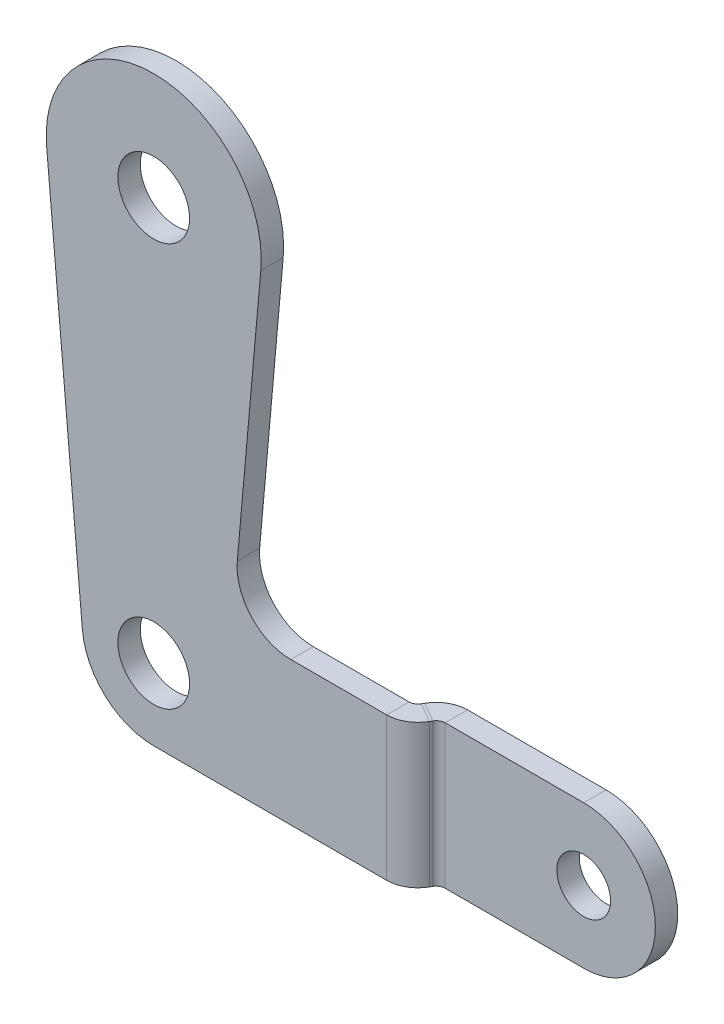
ISO-10303-21;
HEADER;
FILE_DESCRIPTION(('STEP AP214'),'2;1');
FILE_NAME('part.step','',(''),(''),'','','');
FILE_SCHEMA(('AUTOMOTIVE_DESIGN { 1 0 10303 214 1 1 1 1 }'));
ENDSEC;
DATA;
#1=APPLICATION_CONTEXT('core data for automotive mechanical design processes');
#2=APPLICATION_PROTOCOL_DEFINITION('international standard','automotive_design',2000,#1);
#3=PRODUCT_CONTEXT('',#1,'mechanical');
#4=PRODUCT('Part','Part','',(#3));
#5=PRODUCT_RELATED_PRODUCT_CATEGORY('part','',(#4));
#6=PRODUCT_DEFINITION_FORMATION('','',#4);
#7=PRODUCT_DEFINITION_CONTEXT('part definition',#1,'design');
#8=PRODUCT_DEFINITION('design','',#6,#7);
#9=PRODUCT_DEFINITION_SHAPE('','',#8);
#10=(LENGTH_UNIT() NAMED_UNIT(*) SI_UNIT(.MILLI.,.METRE.));
#11=(NAMED_UNIT(*) PLANE_ANGLE_UNIT() SI_UNIT($,.RADIAN.));
#12=(NAMED_UNIT(*) SI_UNIT($,.STERADIAN.) SOLID_ANGLE_UNIT());
#13=UNCERTAINTY_MEASURE_WITH_UNIT(LENGTH_MEASURE(1.E-05),#10,'distance_accuracy_value','');
#14=(GEOMETRIC_REPRESENTATION_CONTEXT(3) GLOBAL_UNCERTAINTY_ASSIGNED_CONTEXT((#13)) GLOBAL_UNIT_ASSIGNED_CONTEXT((#10,
#11,#12)) REPRESENTATION_CONTEXT('',''));
#15=CARTESIAN_POINT('',(0.,0.,0.));
#16=DIRECTION('',(0.,0.,1.));
#17=DIRECTION('',(1.,0.,0.));
#18=AXIS2_PLACEMENT_3D('',#15,#16,#17);
#19=CARTESIAN_POINT('',(22.5055060006911,14.,12.0526411535477));
#20=DIRECTION('',(0.86602540378444,0.,0.499999999999998));
#21=DIRECTION('',(0.499999999999998,0.,-0.86602540378444));
#22=AXIS2_PLACEMENT_3D('',#19,#20,#21);
#23=PLANE('',#22);
#24=DIRECTION('',(0.499999999999998,0.,-0.86602540378444));
#25=VECTOR('',#24,1.);
#26=CARTESIAN_POINT('',(14.8529916681494,-7.99999999999999,25.3071847831589));
#27=LINE('',#26,#25);
#28=CARTESIAN_POINT('',(29.0310889132455,-7.99999999999999,0.749999999999994));
#29=VERTEX_POINT('',#28);
#30=CARTESIAN_POINT('',(29.1754264805429,-7.99999999999999,0.49999999999999));
#31=VERTEX_POINT('',#30);
#32=EDGE_CURVE('E49',#29,#31,#27,.T.);
#33=ORIENTED_EDGE('',*,*,#32,.T.);
#34=DIRECTION('',(0.,1.,0.));
#35=VECTOR('',#34,1.);
#36=CARTESIAN_POINT('',(29.1754264805429,14.,0.499999999999987));
#37=LINE('',#36,#35);
#38=CARTESIAN_POINT('',(29.1754264805429,8.00000000000001,0.499999999999989));
#39=VERTEX_POINT('',#38);
#40=EDGE_CURVE('E313',#31,#39,#37,.T.);
#41=ORIENTED_EDGE('',*,*,#40,.T.);
#42=DIRECTION('',(-0.499999999999998,0.,0.86602540378444));
#43=VECTOR('',#42,1.);
#44=CARTESIAN_POINT('',(22.5055060006911,8.00000000000001,12.0526411535477));
#45=LINE('',#44,#43);
#46=CARTESIAN_POINT('',(29.0310889132455,8.00000000000001,0.749999999999993));
#47=VERTEX_POINT('',#46);
#48=EDGE_CURVE('E305',#39,#47,#45,.T.);
#49=ORIENTED_EDGE('',*,*,#48,.T.);
#50=DIRECTION('',(0.,1.,0.));
#51=VECTOR('',#50,1.);
#52=CARTESIAN_POINT('',(29.0310889132455,14.,0.74999999999999));
#53=LINE('',#52,#51);
#54=EDGE_CURVE('E301',#29,#47,#53,.T.);
#55=ORIENTED_EDGE('',*,*,#54,.F.);
#56=EDGE_LOOP('',(#33,#41,#49,#55));
#57=FACE_BOUND('',#56,.T.);
#58=ADVANCED_FACE('F45',(#57),#23,.T.);
#59=CARTESIAN_POINT('',(22.5055060006911,8.00000000000001,12.0526411535477));
#60=DIRECTION('',(0.,1.,0.));
#61=DIRECTION('',(-0.499999999999998,0.,0.86602540378444));
#62=AXIS2_PLACEMENT_3D('',#59,#60,#61);
#63=PLANE('',#62);
#64=ORIENTED_EDGE('',*,*,#48,.F.);
#65=DIRECTION('',(-0.86602540378444,0.,-0.499999999999998));
#66=VECTOR('',#65,1.);
#67=CARTESIAN_POINT('',(29.1754264805429,8.00000000000001,0.499999999999987));
#68=LINE('',#67,#66);
#69=CARTESIAN_POINT('',(27.0103629710818,8.00000000000001,-0.750000000000008));
#70=VERTEX_POINT('',#69);
#71=EDGE_CURVE('E12',#39,#70,#68,.T.);
#72=ORIENTED_EDGE('',*,*,#71,.T.);
#73=DIRECTION('',(0.499999999999998,0.,-0.86602540378444));
#74=VECTOR('',#73,1.);
#75=CARTESIAN_POINT('',(20.34044249123,8.00000000000001,10.8026411535477));
#76=LINE('',#75,#74);
#77=CARTESIAN_POINT('',(26.8660254037844,8.00000000000001,-0.500000000000004));
#78=VERTEX_POINT('',#77);
#79=EDGE_CURVE('E320',#70,#78,#76,.F.);
#80=ORIENTED_EDGE('',*,*,#79,.T.);
#81=DIRECTION('',(-0.86602540378444,0.,-0.499999999999998));
#82=VECTOR('',#81,1.);
#83=CARTESIAN_POINT('',(29.0310889132455,8.00000000000001,0.74999999999999));
#84=LINE('',#83,#82);
#85=EDGE_CURVE('E304',#47,#78,#84,.T.);
#86=ORIENTED_EDGE('',*,*,#85,.F.);
#87=EDGE_LOOP('',(#64,#72,#80,#86));
#88=FACE_BOUND('',#87,.T.);
#89=ADVANCED_FACE('F47',(#88),#63,.T.);
#90=CARTESIAN_POINT('',(14.8529916681494,-7.99999999999999,25.3071847831589));
#91=DIRECTION('',(0.,-1.,0.));
#92=DIRECTION('',(0.499999999999998,0.,-0.86602540378444));
#93=AXIS2_PLACEMENT_3D('',#90,#91,#92);
#94=PLANE('',#93);
#95=DIRECTION('',(0.499999999999998,0.,-0.86602540378444));
#96=VECTOR('',#95,1.);
#97=CARTESIAN_POINT('',(20.34044249123,-7.99999999999999,10.8026411535477));
#98=LINE('',#97,#96);
#99=CARTESIAN_POINT('',(26.8660254037844,-7.99999999999999,-0.500000000000007));
#100=VERTEX_POINT('',#99);
#101=CARTESIAN_POINT('',(27.0103629710818,-7.99999999999999,-0.749999999999993));
#102=VERTEX_POINT('',#101);
#103=EDGE_CURVE('E68',#100,#102,#98,.T.);
#104=ORIENTED_EDGE('',*,*,#103,.T.);
#105=DIRECTION('',(0.86602540378444,0.,0.499999999999998));
#106=VECTOR('',#105,1.);
#107=CARTESIAN_POINT('',(29.1754264805429,-7.99999999999999,0.499999999999983));
#108=LINE('',#107,#106);
#109=EDGE_CURVE('E316',#102,#31,#108,.T.);
#110=ORIENTED_EDGE('',*,*,#109,.T.);
#111=ORIENTED_EDGE('',*,*,#32,.F.);
#112=DIRECTION('',(0.86602540378444,0.,0.499999999999998));
#113=VECTOR('',#112,1.);
#114=CARTESIAN_POINT('',(29.0310889132455,-7.99999999999999,0.749999999999987));
#115=LINE('',#114,#113);
#116=EDGE_CURVE('E310',#100,#29,#115,.T.);
#117=ORIENTED_EDGE('',*,*,#116,.F.);
#118=EDGE_LOOP('',(#104,#110,#111,#117));
#119=FACE_BOUND('',#118,.T.);
#120=ADVANCED_FACE('F329',(#119),#94,.T.);
#121=CARTESIAN_POINT('',(20.34044249123,14.,10.8026411535477));
#122=DIRECTION('',(0.86602540378444,0.,0.499999999999998));
#123=DIRECTION('',(0.499999999999998,0.,-0.86602540378444));
#124=AXIS2_PLACEMENT_3D('',#121,#122,#123);
#125=PLANE('',#124);
#126=DIRECTION('',(0.,1.,0.));
#127=VECTOR('',#126,1.);
#128=CARTESIAN_POINT('',(27.0103629710818,14.,-0.750000000000008));
#129=LINE('',#128,#127);
#130=EDGE_CURVE('E54',#102,#70,#129,.T.);
#131=ORIENTED_EDGE('',*,*,#130,.F.);
#132=ORIENTED_EDGE('',*,*,#103,.F.);
#133=DIRECTION('',(0.,1.,0.));
#134=VECTOR('',#133,1.);
#135=CARTESIAN_POINT('',(26.8660254037844,14.,-0.500000000000004));
#136=LINE('',#135,#134);
#137=EDGE_CURVE('E308',#100,#78,#136,.T.);
#138=ORIENTED_EDGE('',*,*,#137,.T.);
#139=ORIENTED_EDGE('',*,*,#79,.F.);
#140=EDGE_LOOP('',(#131,#132,#138,#139));
#141=FACE_BOUND('',#140,.T.);
#142=ADVANCED_FACE('F368',(#141),#125,.F.);
#143=CARTESIAN_POINT('',(0.,0.,2.5));
#144=DIRECTION('',(0.,0.,1.));
#145=DIRECTION('',(1.,0.,0.));
#146=AXIS2_PLACEMENT_3D('',#143,#144,#145);
#147=CYLINDRICAL_SURFACE('',#146,7.99999999999999);
#148=DIRECTION('',(0.,0.,1.));
#149=VECTOR('',#148,1.);
#150=CARTESIAN_POINT('',(-7.96833238436087,-0.711111111111112,2.5));
#151=LINE('',#150,#149);
#152=CARTESIAN_POINT('',(-7.96833238436087,-0.711111111111112,0.));
#153=VERTEX_POINT('',#152);
#154=CARTESIAN_POINT('',(-7.96833238436087,-0.711111111111112,2.5));
#155=VERTEX_POINT('',#154);
#156=EDGE_CURVE('E290',#153,#155,#151,.T.);
#157=ORIENTED_EDGE('',*,*,#156,.F.);
#158=CARTESIAN_POINT('',(0.,0.,0.));
#159=DIRECTION('',(0.,0.,1.));
#160=DIRECTION('',(1.,0.,0.));
#161=AXIS2_PLACEMENT_3D('',#158,#159,#160);
#162=CIRCLE('',#161,7.99999999999999);
#163=CARTESIAN_POINT('',(0.,-7.99999999999999,0.));
#164=VERTEX_POINT('',#163);
#165=EDGE_CURVE('E297',#153,#164,#162,.T.);
#166=ORIENTED_EDGE('',*,*,#165,.T.);
#167=DIRECTION('',(0.,0.,1.));
#168=VECTOR('',#167,1.);
#169=CARTESIAN_POINT('',(0.,-7.99999999999999,2.5));
#170=LINE('',#169,#168);
#171=CARTESIAN_POINT('',(0.,-7.99999999999999,2.5));
#172=VERTEX_POINT('',#171);
#173=EDGE_CURVE('E295',#164,#172,#170,.T.);
#174=ORIENTED_EDGE('',*,*,#173,.T.);
#175=CARTESIAN_POINT('',(0.,0.,2.5));
#176=DIRECTION('',(0.,0.,1.));
#177=DIRECTION('',(1.,0.,0.));
#178=AXIS2_PLACEMENT_3D('',#175,#176,#177);
#179=CIRCLE('',#178,7.99999999999999);
#180=EDGE_CURVE('E246',#155,#172,#179,.T.);
#181=ORIENTED_EDGE('',*,*,#180,.F.);
#182=EDGE_LOOP('',(#157,#166,#174,#181));
#183=FACE_BOUND('',#182,.T.);
#184=ADVANCED_FACE('F370',(#183),#147,.T.);
#185=CARTESIAN_POINT('',(-11.9524985765413,43.9333333333333,2.5));
#186=DIRECTION('',(-0.99604154804511,-0.0888888888888891,0.));
#187=DIRECTION('',(0.0888888888888891,-0.99604154804511,0.));
#188=AXIS2_PLACEMENT_3D('',#185,#186,#187);
#189=PLANE('',#188);
#190=DIRECTION('',(0.,0.,1.));
#191=VECTOR('',#190,1.);
#192=CARTESIAN_POINT('',(-11.9524985765413,43.9333333333333,2.5));
#193=LINE('',#192,#191);
#194=CARTESIAN_POINT('',(-11.9524985765413,43.9333333333333,0.));
#195=VERTEX_POINT('',#194);
#196=CARTESIAN_POINT('',(-11.9524985765413,43.9333333333333,2.5));
#197=VERTEX_POINT('',#196);
#198=EDGE_CURVE('E285',#195,#197,#193,.T.);
#199=ORIENTED_EDGE('',*,*,#198,.F.);
#200=DIRECTION('',(0.0888888888888891,-0.99604154804511,0.));
#201=VECTOR('',#200,1.);
#202=CARTESIAN_POINT('',(-11.9524985765413,43.9333333333333,0.));
#203=LINE('',#202,#201);
#204=EDGE_CURVE('E292',#195,#153,#203,.T.);
#205=ORIENTED_EDGE('',*,*,#204,.T.);
#206=ORIENTED_EDGE('',*,*,#156,.T.);
#207=DIRECTION('',(0.0888888888888891,-0.99604154804511,0.));
#208=VECTOR('',#207,1.);
#209=CARTESIAN_POINT('',(-11.9524985765413,43.9333333333333,2.5));
#210=LINE('',#209,#208);
#211=EDGE_CURVE('E249',#197,#155,#210,.T.);
#212=ORIENTED_EDGE('',*,*,#211,.F.);
#213=EDGE_LOOP('',(#199,#205,#206,#212));
#214=FACE_BOUND('',#213,.T.);
#215=ADVANCED_FACE('F374',(#214),#189,.T.);
#216=CARTESIAN_POINT('',(0.,45.,2.5));
#217=DIRECTION('',(0.,0.,1.));
#218=DIRECTION('',(1.,0.,0.));
#219=AXIS2_PLACEMENT_3D('',#216,#217,#218);
#220=CYLINDRICAL_SURFACE('',#219,12.);
#221=DIRECTION('',(0.,0.,1.));
#222=VECTOR('',#221,1.);
#223=CARTESIAN_POINT('',(11.9524985765413,43.9333333333333,2.5));
#224=LINE('',#223,#222);
#225=CARTESIAN_POINT('',(11.9524985765413,43.9333333333333,0.));
#226=VERTEX_POINT('',#225);
#227=CARTESIAN_POINT('',(11.9524985765413,43.9333333333333,2.5));
#228=VERTEX_POINT('',#227);
#229=EDGE_CURVE('E280',#226,#228,#224,.T.);
#230=ORIENTED_EDGE('',*,*,#229,.F.);
#231=CARTESIAN_POINT('',(0.,45.,0.));
#232=DIRECTION('',(0.,0.,1.));
#233=DIRECTION('',(1.,0.,0.));
#234=AXIS2_PLACEMENT_3D('',#231,#232,#233);
#235=CIRCLE('',#234,12.);
#236=EDGE_CURVE('E287',#226,#195,#235,.T.);
#237=ORIENTED_EDGE('',*,*,#236,.T.);
#238=ORIENTED_EDGE('',*,*,#198,.T.);
#239=CARTESIAN_POINT('',(0.,45.,2.5));
#240=DIRECTION('',(0.,0.,1.));
#241=DIRECTION('',(1.,0.,0.));
#242=AXIS2_PLACEMENT_3D('',#239,#240,#241);
#243=CIRCLE('',#242,12.);
#244=EDGE_CURVE('E252',#228,#197,#243,.T.);
#245=ORIENTED_EDGE('',*,*,#244,.F.);
#246=EDGE_LOOP('',(#230,#237,#238,#245));
#247=FACE_BOUND('',#246,.T.);
#248=ADVANCED_FACE('F414',(#247),#220,.T.);
#249=CARTESIAN_POINT('',(11.9524985765413,43.9333333333333,2.5));
#250=DIRECTION('',(0.99604154804511,-0.0888888888888893,0.));
#251=DIRECTION('',(0.0888888888888893,0.99604154804511,0.));
#252=AXIS2_PLACEMENT_3D('',#249,#250,#251);
#253=PLANE('',#252);
#254=DIRECTION('',(0.0888888888888893,0.99604154804511,0.));
#255=VECTOR('',#254,1.);
#256=CARTESIAN_POINT('',(11.9524985765413,43.9333333333333,0.));
#257=LINE('',#256,#255);
#258=CARTESIAN_POINT('',(9.32877937681273,14.5333333333333,0.));
#259=VERTEX_POINT('',#258);
#260=EDGE_CURVE('E282',#259,#226,#257,.T.);
#261=ORIENTED_EDGE('',*,*,#260,.T.);
#262=ORIENTED_EDGE('',*,*,#229,.T.);
#263=DIRECTION('',(0.0888888888888893,0.99604154804511,0.));
#264=VECTOR('',#263,1.);
#265=CARTESIAN_POINT('',(11.9524985765413,43.9333333333333,2.5));
#266=LINE('',#265,#264);
#267=CARTESIAN_POINT('',(9.32877937681273,14.5333333333333,2.5));
#268=VERTEX_POINT('',#267);
#269=EDGE_CURVE('E255',#268,#228,#266,.T.);
#270=ORIENTED_EDGE('',*,*,#269,.F.);
#271=DIRECTION('',(0.,0.,1.));
#272=VECTOR('',#271,1.);
#273=CARTESIAN_POINT('',(9.32877937681273,14.5333333333333,2.5));
#274=LINE('',#273,#272);
#275=EDGE_CURVE('E275',#259,#268,#274,.T.);
#276=ORIENTED_EDGE('',*,*,#275,.F.);
#277=EDGE_LOOP('',(#261,#262,#270,#276));
#278=FACE_BOUND('',#277,.T.);
#279=ADVANCED_FACE('F418',(#278),#253,.T.);
#280=CARTESIAN_POINT('',(15.3050286650834,14.,2.5));
#281=DIRECTION('',(0.,0.,1.));
#282=DIRECTION('',(1.,0.,0.));
#283=AXIS2_PLACEMENT_3D('',#280,#281,#282);
#284=CYLINDRICAL_SURFACE('',#283,6.);
#285=DIRECTION('',(0.,0.,1.));
#286=VECTOR('',#285,1.);
#287=CARTESIAN_POINT('',(15.3050286650834,8.00000000000001,2.5));
#288=LINE('',#287,#286);
#289=CARTESIAN_POINT('',(15.3050286650834,8.00000000000001,0.));
#290=VERTEX_POINT('',#289);
#291=CARTESIAN_POINT('',(15.3050286650834,8.00000000000001,2.5));
#292=VERTEX_POINT('',#291);
#293=EDGE_CURVE('E238',#290,#292,#288,.T.);
#294=ORIENTED_EDGE('',*,*,#293,.F.);
#295=CARTESIAN_POINT('',(15.3050286650834,14.,0.));
#296=DIRECTION('',(0.,0.,-1.));
#297=DIRECTION('',(-1.,0.,0.));
#298=AXIS2_PLACEMENT_3D('',#295,#296,#297);
#299=CIRCLE('',#298,6.);
#300=EDGE_CURVE('E277',#290,#259,#299,.T.);
#301=ORIENTED_EDGE('',*,*,#300,.T.);
#302=ORIENTED_EDGE('',*,*,#275,.T.);
#303=CARTESIAN_POINT('',(15.3050286650834,14.,2.5));
#304=DIRECTION('',(0.,0.,-1.));
#305=DIRECTION('',(1.,0.,0.));
#306=AXIS2_PLACEMENT_3D('',#303,#304,#305);
#307=CIRCLE('',#306,6.);
#308=EDGE_CURVE('E258',#292,#268,#307,.T.);
#309=ORIENTED_EDGE('',*,*,#308,.F.);
#310=EDGE_LOOP('',(#294,#301,#302,#309));
#311=FACE_BOUND('',#310,.T.);
#312=ADVANCED_FACE('F422',(#311),#284,.F.);
#313=CARTESIAN_POINT('',(0.,45.,2.5));
#314=DIRECTION('',(0.,0.,1.));
#315=DIRECTION('',(1.,0.,0.));
#316=AXIS2_PLACEMENT_3D('',#313,#314,#315);
#317=CYLINDRICAL_SURFACE('',#316,4.);
#318=CARTESIAN_POINT('',(0.,45.,2.5));
#319=DIRECTION('',(0.,0.,1.));
#320=DIRECTION('',(1.,0.,0.));
#321=AXIS2_PLACEMENT_3D('',#318,#319,#320);
#322=CIRCLE('',#321,4.);
#323=CARTESIAN_POINT('',(4.,45.,2.5));
#324=VERTEX_POINT('',#323);
#325=EDGE_CURVE('E272',#324,#324,#322,.T.);
#326=ORIENTED_EDGE('',*,*,#325,.T.);
#327=EDGE_LOOP('',(#326));
#328=FACE_BOUND('',#327,.T.);
#329=CARTESIAN_POINT('',(0.,45.,0.));
#330=DIRECTION('',(0.,0.,1.));
#331=DIRECTION('',(1.,0.,0.));
#332=AXIS2_PLACEMENT_3D('',#329,#330,#331);
#333=CIRCLE('',#332,4.);
#334=CARTESIAN_POINT('',(4.,45.,0.));
#335=VERTEX_POINT('',#334);
#336=EDGE_CURVE('E235',#335,#335,#333,.T.);
#337=ORIENTED_EDGE('',*,*,#336,.F.);
#338=EDGE_LOOP('',(#337));
#339=FACE_BOUND('',#338,.T.);
#340=ADVANCED_FACE('F426',(#328,#339),#317,.F.);
#341=CARTESIAN_POINT('',(0.,0.,2.5));
#342=DIRECTION('',(0.,0.,1.));
#343=DIRECTION('',(1.,0.,0.));
#344=AXIS2_PLACEMENT_3D('',#341,#342,#343);
#345=CYLINDRICAL_SURFACE('',#344,4.00000000000001);
#346=CARTESIAN_POINT('',(0.,0.,2.5));
#347=DIRECTION('',(0.,0.,1.));
#348=DIRECTION('',(1.,0.,0.));
#349=AXIS2_PLACEMENT_3D('',#346,#347,#348);
#350=CIRCLE('',#349,4.00000000000001);
#351=CARTESIAN_POINT('',(4.00000000000001,0.,2.5));
#352=VERTEX_POINT('',#351);
#353=EDGE_CURVE('E269',#352,#352,#350,.T.);
#354=ORIENTED_EDGE('',*,*,#353,.T.);
#355=EDGE_LOOP('',(#354));
#356=FACE_BOUND('',#355,.T.);
#357=CARTESIAN_POINT('',(0.,0.,0.));
#358=DIRECTION('',(0.,0.,1.));
#359=DIRECTION('',(1.,0.,0.));
#360=AXIS2_PLACEMENT_3D('',#357,#358,#359);
#361=CIRCLE('',#360,4.00000000000001);
#362=CARTESIAN_POINT('',(4.00000000000001,0.,0.));
#363=VERTEX_POINT('',#362);
#364=EDGE_CURVE('E232',#363,#363,#361,.T.);
#365=ORIENTED_EDGE('',*,*,#364,.F.);
#366=EDGE_LOOP('',(#365));
#367=FACE_BOUND('',#366,.T.);
#368=ADVANCED_FACE('F430',(#356,#367),#345,.F.);
#369=CARTESIAN_POINT('',(15.3050286650834,14.,2.5));
#370=DIRECTION('',(0.,0.,1.));
#371=DIRECTION('',(1.,0.,0.));
#372=AXIS2_PLACEMENT_3D('',#369,#370,#371);
#373=PLANE('',#372);
#374=ORIENTED_EDGE('',*,*,#353,.F.);
#375=EDGE_LOOP('',(#374));
#376=FACE_BOUND('',#375,.T.);
#377=ORIENTED_EDGE('',*,*,#325,.F.);
#378=EDGE_LOOP('',(#377));
#379=FACE_BOUND('',#378,.T.);
#380=DIRECTION('',(1.,0.,0.));
#381=VECTOR('',#380,1.);
#382=CARTESIAN_POINT('',(0.,-7.99999999999999,2.5));
#383=LINE('',#382,#381);
#384=CARTESIAN_POINT('',(26.,-7.99999999999999,2.5));
#385=VERTEX_POINT('',#384);
#386=EDGE_CURVE('E266',#172,#385,#383,.T.);
#387=ORIENTED_EDGE('',*,*,#386,.T.);
#388=DIRECTION('',(0.,1.,0.));
#389=VECTOR('',#388,1.);
#390=CARTESIAN_POINT('',(26.,14.,2.5));
#391=LINE('',#390,#389);
#392=CARTESIAN_POINT('',(26.,8.,2.5));
#393=VERTEX_POINT('',#392);
#394=EDGE_CURVE('E263',#385,#393,#391,.T.);
#395=ORIENTED_EDGE('',*,*,#394,.T.);
#396=DIRECTION('',(-1.,0.,0.));
#397=VECTOR('',#396,1.);
#398=CARTESIAN_POINT('',(15.3050286650834,8.00000000000001,2.5));
#399=LINE('',#398,#397);
#400=EDGE_CURVE('E261',#393,#292,#399,.T.);
#401=ORIENTED_EDGE('',*,*,#400,.T.);
#402=ORIENTED_EDGE('',*,*,#308,.T.);
#403=ORIENTED_EDGE('',*,*,#269,.T.);
#404=ORIENTED_EDGE('',*,*,#244,.T.);
#405=ORIENTED_EDGE('',*,*,#211,.T.);
#406=ORIENTED_EDGE('',*,*,#180,.T.);
#407=EDGE_LOOP('',(#387,#395,#401,#402,#403,#404,#405,#406));
#408=FACE_BOUND('',#407,.T.);
#409=ADVANCED_FACE('F434',(#376,#379,#408),#373,.T.);
#410=CARTESIAN_POINT('',(15.3050286650834,8.00000000000001,2.5));
#411=DIRECTION('',(0.,1.,0.));
#412=DIRECTION('',(-1.,0.,0.));
#413=AXIS2_PLACEMENT_3D('',#410,#411,#412);
#414=PLANE('',#413);
#415=ORIENTED_EDGE('',*,*,#400,.F.);
#416=DIRECTION('',(0.,0.,-1.));
#417=VECTOR('',#416,1.);
#418=CARTESIAN_POINT('',(26.,8.00000000000001,2.5));
#419=LINE('',#418,#417);
#420=CARTESIAN_POINT('',(26.,8.00000000000001,0.));
#421=VERTEX_POINT('',#420);
#422=EDGE_CURVE('E243',#393,#421,#419,.T.);
#423=ORIENTED_EDGE('',*,*,#422,.T.);
#424=DIRECTION('',(1.,0.,0.));
#425=VECTOR('',#424,1.);
#426=CARTESIAN_POINT('',(15.3050286650834,8.00000000000001,0.));
#427=LINE('',#426,#425);
#428=EDGE_CURVE('E241',#421,#290,#427,.F.);
#429=ORIENTED_EDGE('',*,*,#428,.T.);
#430=ORIENTED_EDGE('',*,*,#293,.T.);
#431=EDGE_LOOP('',(#415,#423,#429,#430));
#432=FACE_BOUND('',#431,.T.);
#433=ADVANCED_FACE('F438',(#432),#414,.T.);
#434=CARTESIAN_POINT('',(15.3050286650834,14.,0.));
#435=DIRECTION('',(0.,0.,1.));
#436=DIRECTION('',(1.,0.,0.));
#437=AXIS2_PLACEMENT_3D('',#434,#435,#436);
#438=PLANE('',#437);
#439=DIRECTION('',(0.,1.,0.));
#440=VECTOR('',#439,1.);
#441=CARTESIAN_POINT('',(26.,14.,0.));
#442=LINE('',#441,#440);
#443=CARTESIAN_POINT('',(26.,-7.99999999999999,0.));
#444=VERTEX_POINT('',#443);
#445=EDGE_CURVE('E221',#444,#421,#442,.T.);
#446=ORIENTED_EDGE('',*,*,#445,.F.);
#447=DIRECTION('',(1.,0.,0.));
#448=VECTOR('',#447,1.);
#449=CARTESIAN_POINT('',(15.3050286650834,-7.99999999999999,0.));
#450=LINE('',#449,#448);
#451=EDGE_CURVE('E229',#164,#444,#450,.T.);
#452=ORIENTED_EDGE('',*,*,#451,.F.);
#453=ORIENTED_EDGE('',*,*,#165,.F.);
#454=ORIENTED_EDGE('',*,*,#204,.F.);
#455=ORIENTED_EDGE('',*,*,#236,.F.);
#456=ORIENTED_EDGE('',*,*,#260,.F.);
#457=ORIENTED_EDGE('',*,*,#300,.F.);
#458=ORIENTED_EDGE('',*,*,#428,.F.);
#459=EDGE_LOOP('',(#446,#452,#453,#454,#455,#456,#457,#458));
#460=FACE_BOUND('',#459,.T.);
#461=ORIENTED_EDGE('',*,*,#336,.T.);
#462=EDGE_LOOP('',(#461));
#463=FACE_BOUND('',#462,.T.);
#464=ORIENTED_EDGE('',*,*,#364,.T.);
#465=EDGE_LOOP('',(#464));
#466=FACE_BOUND('',#465,.T.);
#467=ADVANCED_FACE('F441',(#460,#463,#466),#438,.F.);
#468=CARTESIAN_POINT('',(0.,-7.99999999999999,2.5));
#469=DIRECTION('',(0.,-1.,0.));
#470=DIRECTION('',(1.,0.,0.));
#471=AXIS2_PLACEMENT_3D('',#468,#469,#470);
#472=PLANE('',#471);
#473=ORIENTED_EDGE('',*,*,#451,.T.);
#474=DIRECTION('',(0.,0.,1.));
#475=VECTOR('',#474,1.);
#476=CARTESIAN_POINT('',(26.,-7.99999999999999,2.5));
#477=LINE('',#476,#475);
#478=EDGE_CURVE('E226',#444,#385,#477,.T.);
#479=ORIENTED_EDGE('',*,*,#478,.T.);
#480=ORIENTED_EDGE('',*,*,#386,.F.);
#481=ORIENTED_EDGE('',*,*,#173,.F.);
#482=EDGE_LOOP('',(#473,#479,#480,#481));
#483=FACE_BOUND('',#482,.T.);
#484=ADVANCED_FACE('F365',(#483),#472,.T.);
#485=CARTESIAN_POINT('',(26.,-7.99999999999999,-1.));
#486=DIRECTION('',(0.,-1.,0.));
#487=DIRECTION('',(0.,0.,-1.));
#488=AXIS2_PLACEMENT_3D('',#485,#486,#487);
#489=PLANE('',#488);
#490=ORIENTED_EDGE('',*,*,#478,.F.);
#491=CARTESIAN_POINT('',(26.,-7.99999999999999,-1.));
#492=DIRECTION('',(0.,1.,0.));
#493=DIRECTION('',(-1.,0.,0.));
#494=AXIS2_PLACEMENT_3D('',#491,#492,#493);
#495=CIRCLE('',#494,1.);
#496=EDGE_CURVE('E208',#444,#100,#495,.T.);
#497=ORIENTED_EDGE('',*,*,#496,.T.);
#498=ORIENTED_EDGE('',*,*,#116,.T.);
#499=CARTESIAN_POINT('',(26.,-7.99999999999999,-1.));
#500=DIRECTION('',(0.,1.,0.));
#501=DIRECTION('',(0.,0.,1.));
#502=AXIS2_PLACEMENT_3D('',#499,#500,#501);
#503=CIRCLE('',#502,3.5);
#504=EDGE_CURVE('E214',#385,#29,#503,.T.);
#505=ORIENTED_EDGE('',*,*,#504,.F.);
#506=EDGE_LOOP('',(#490,#497,#498,#505));
#507=FACE_BOUND('',#506,.T.);
#508=ADVANCED_FACE('F407',(#507),#489,.T.);
#509=CARTESIAN_POINT('',(26.,8.,-1.));
#510=DIRECTION('',(0.,1.,0.));
#511=DIRECTION('',(0.,0.,1.));
#512=AXIS2_PLACEMENT_3D('',#509,#510,#511);
#513=PLANE('',#512);
#514=ORIENTED_EDGE('',*,*,#85,.T.);
#515=CARTESIAN_POINT('',(26.,8.00000000000001,-1.));
#516=DIRECTION('',(0.,1.,0.));
#517=DIRECTION('',(-1.,0.,0.));
#518=AXIS2_PLACEMENT_3D('',#515,#516,#517);
#519=CIRCLE('',#518,1.);
#520=EDGE_CURVE('E218',#78,#421,#519,.F.);
#521=ORIENTED_EDGE('',*,*,#520,.T.);
#522=ORIENTED_EDGE('',*,*,#422,.F.);
#523=CARTESIAN_POINT('',(26.,8.,-1.));
#524=DIRECTION('',(0.,-1.,0.));
#525=DIRECTION('',(0.,0.,-1.));
#526=AXIS2_PLACEMENT_3D('',#523,#524,#525);
#527=CIRCLE('',#526,3.5);
#528=EDGE_CURVE('E217',#47,#393,#527,.T.);
#529=ORIENTED_EDGE('',*,*,#528,.F.);
#530=EDGE_LOOP('',(#514,#521,#522,#529));
#531=FACE_BOUND('',#530,.T.);
#532=ADVANCED_FACE('F400',(#531),#513,.T.);
#533=CARTESIAN_POINT('',(26.,-16.3646464207331,-1.));
#534=DIRECTION('',(0.,1.,0.));
#535=DIRECTION('',(-1.,0.,0.));
#536=AXIS2_PLACEMENT_3D('',#533,#534,#535);
#537=CYLINDRICAL_SURFACE('',#536,3.5);
#538=ORIENTED_EDGE('',*,*,#528,.T.);
#539=ORIENTED_EDGE('',*,*,#394,.F.);
#540=ORIENTED_EDGE('',*,*,#504,.T.);
#541=ORIENTED_EDGE('',*,*,#54,.T.);
#542=EDGE_LOOP('',(#538,#539,#540,#541));
#543=FACE_BOUND('',#542,.T.);
#544=ADVANCED_FACE('F397',(#543),#537,.T.);
#545=CARTESIAN_POINT('',(26.,-16.3646464207331,-1.));
#546=DIRECTION('',(0.,1.,0.));
#547=DIRECTION('',(-1.,0.,0.));
#548=AXIS2_PLACEMENT_3D('',#545,#546,#547);
#549=CYLINDRICAL_SURFACE('',#548,1.);
#550=ORIENTED_EDGE('',*,*,#520,.F.);
#551=ORIENTED_EDGE('',*,*,#137,.F.);
#552=ORIENTED_EDGE('',*,*,#496,.F.);
#553=ORIENTED_EDGE('',*,*,#445,.T.);
#554=EDGE_LOOP('',(#550,#551,#552,#553));
#555=FACE_BOUND('',#554,.T.);
#556=ADVANCED_FACE('F396',(#555),#549,.F.);
#557=CARTESIAN_POINT('',(30.0414518843274,-7.99999999999999,0.999999999999985));
#558=DIRECTION('',(0.,1.,0.));
#559=DIRECTION('',(0.,0.,1.));
#560=AXIS2_PLACEMENT_3D('',#557,#558,#559);
#561=PLANE('',#560);
#562=ORIENTED_EDGE('',*,*,#109,.F.);
#563=CARTESIAN_POINT('',(30.0414518843274,-7.99999999999999,0.999999999999985));
#564=DIRECTION('',(0.,1.,0.));
#565=DIRECTION('',(-1.,0.,0.));
#566=AXIS2_PLACEMENT_3D('',#563,#564,#565);
#567=CIRCLE('',#566,3.5);
#568=CARTESIAN_POINT('',(30.0414518843274,-7.99999999999999,-2.50000000000001));
#569=VERTEX_POINT('',#568);
#570=EDGE_CURVE('E210',#102,#569,#567,.F.);
#571=ORIENTED_EDGE('',*,*,#570,.T.);
#572=DIRECTION('',(0.,0.,1.));
#573=VECTOR('',#572,1.);
#574=CARTESIAN_POINT('',(30.0414518843274,-7.99999999999999,0.));
#575=LINE('',#574,#573);
#576=CARTESIAN_POINT('',(30.0414518843274,-7.99999999999999,0.));
#577=VERTEX_POINT('',#576);
#578=EDGE_CURVE('E195',#569,#577,#575,.T.);
#579=ORIENTED_EDGE('',*,*,#578,.T.);
#580=CARTESIAN_POINT('',(30.0414518843274,-7.99999999999999,0.999999999999985));
#581=DIRECTION('',(0.,-1.,0.));
#582=DIRECTION('',(0.,0.,-1.));
#583=AXIS2_PLACEMENT_3D('',#580,#581,#582);
#584=CIRCLE('',#583,1.);
#585=EDGE_CURVE('E201',#31,#577,#584,.T.);
#586=ORIENTED_EDGE('',*,*,#585,.F.);
#587=EDGE_LOOP('',(#562,#571,#579,#586));
#588=FACE_BOUND('',#587,.T.);
#589=ADVANCED_FACE('F331',(#588),#561,.F.);
#590=CARTESIAN_POINT('',(30.0414518843274,8.00000000000001,0.999999999999985));
#591=DIRECTION('',(0.,-1.,0.));
#592=DIRECTION('',(0.,0.,-1.));
#593=AXIS2_PLACEMENT_3D('',#590,#591,#592);
#594=PLANE('',#593);
#595=DIRECTION('',(0.,0.,-1.));
#596=VECTOR('',#595,1.);
#597=CARTESIAN_POINT('',(30.0414518843274,8.00000000000001,0.));
#598=LINE('',#597,#596);
#599=CARTESIAN_POINT('',(30.0414518843274,8.00000000000001,0.));
#600=VERTEX_POINT('',#599);
#601=CARTESIAN_POINT('',(30.0414518843274,8.00000000000001,-2.50000000000002));
#602=VERTEX_POINT('',#601);
#603=EDGE_CURVE('E168',#600,#602,#598,.T.);
#604=ORIENTED_EDGE('',*,*,#603,.T.);
#605=CARTESIAN_POINT('',(30.0414518843274,8.00000000000001,0.999999999999985));
#606=DIRECTION('',(0.,1.,0.));
#607=DIRECTION('',(-1.,0.,0.));
#608=AXIS2_PLACEMENT_3D('',#605,#606,#607);
#609=CIRCLE('',#608,3.5);
#610=EDGE_CURVE('E205',#602,#70,#609,.T.);
#611=ORIENTED_EDGE('',*,*,#610,.T.);
#612=ORIENTED_EDGE('',*,*,#71,.F.);
#613=CARTESIAN_POINT('',(30.0414518843274,8.00000000000001,0.999999999999985));
#614=DIRECTION('',(0.,1.,0.));
#615=DIRECTION('',(0.,0.,1.));
#616=AXIS2_PLACEMENT_3D('',#613,#614,#615);
#617=CIRCLE('',#616,1.);
#618=EDGE_CURVE('E204',#600,#39,#617,.T.);
#619=ORIENTED_EDGE('',*,*,#618,.F.);
#620=EDGE_LOOP('',(#604,#611,#612,#619));
#621=FACE_BOUND('',#620,.T.);
#622=ADVANCED_FACE('F381',(#621),#594,.F.);
#623=CARTESIAN_POINT('',(30.0414518843274,-16.6734601657673,0.999999999999985));
#624=DIRECTION('',(0.,1.,0.));
#625=DIRECTION('',(-1.,0.,0.));
#626=AXIS2_PLACEMENT_3D('',#623,#624,#625);
#627=CYLINDRICAL_SURFACE('',#626,1.);
#628=ORIENTED_EDGE('',*,*,#618,.T.);
#629=ORIENTED_EDGE('',*,*,#40,.F.);
#630=ORIENTED_EDGE('',*,*,#585,.T.);
#631=DIRECTION('',(0.,1.,0.));
#632=VECTOR('',#631,1.);
#633=CARTESIAN_POINT('',(30.0414518843274,14.,0.));
#634=LINE('',#633,#632);
#635=EDGE_CURVE('E199',#577,#600,#634,.T.);
#636=ORIENTED_EDGE('',*,*,#635,.T.);
#637=EDGE_LOOP('',(#628,#629,#630,#636));
#638=FACE_BOUND('',#637,.T.);
#639=ADVANCED_FACE('F383',(#638),#627,.F.);
#640=CARTESIAN_POINT('',(30.0414518843274,-16.6734601657673,0.999999999999985));
#641=DIRECTION('',(0.,1.,0.));
#642=DIRECTION('',(-1.,0.,0.));
#643=AXIS2_PLACEMENT_3D('',#640,#641,#642);
#644=CYLINDRICAL_SURFACE('',#643,3.5);
#645=ORIENTED_EDGE('',*,*,#610,.F.);
#646=DIRECTION('',(0.,1.,0.));
#647=VECTOR('',#646,1.);
#648=CARTESIAN_POINT('',(30.0414518843274,14.,-2.50000000000001));
#649=LINE('',#648,#647);
#650=EDGE_CURVE('E335',#569,#602,#649,.T.);
#651=ORIENTED_EDGE('',*,*,#650,.F.);
#652=ORIENTED_EDGE('',*,*,#570,.F.);
#653=ORIENTED_EDGE('',*,*,#130,.T.);
#654=EDGE_LOOP('',(#645,#651,#652,#653));
#655=FACE_BOUND('',#654,.T.);
#656=ADVANCED_FACE('F333',(#655),#644,.T.);
#657=CARTESIAN_POINT('',(45.5,0.,0.));
#658=DIRECTION('',(0.,0.,1.));
#659=DIRECTION('',(1.,0.,0.));
#660=AXIS2_PLACEMENT_3D('',#657,#658,#659);
#661=CYLINDRICAL_SURFACE('',#660,3.);
#662=CARTESIAN_POINT('',(45.5,0.,0.));
#663=DIRECTION('',(0.,0.,1.));
#664=DIRECTION('',(1.,0.,0.));
#665=AXIS2_PLACEMENT_3D('',#662,#663,#664);
#666=CIRCLE('',#665,3.);
#667=CARTESIAN_POINT('',(48.5,0.,0.));
#668=VERTEX_POINT('',#667);
#669=EDGE_CURVE('E192',#668,#668,#666,.T.);
#670=ORIENTED_EDGE('',*,*,#669,.T.);
#671=EDGE_LOOP('',(#670));
#672=FACE_BOUND('',#671,.T.);
#673=CARTESIAN_POINT('',(45.5,0.,-2.50000000000002));
#674=DIRECTION('',(0.,0.,1.));
#675=DIRECTION('',(1.,0.,0.));
#676=AXIS2_PLACEMENT_3D('',#673,#674,#675);
#677=CIRCLE('',#676,3.);
#678=CARTESIAN_POINT('',(48.5,0.,-2.50000000000002));
#679=VERTEX_POINT('',#678);
#680=EDGE_CURVE('E337',#679,#679,#677,.T.);
#681=ORIENTED_EDGE('',*,*,#680,.F.);
#682=EDGE_LOOP('',(#681));
#683=FACE_BOUND('',#682,.T.);
#684=ADVANCED_FACE('F390',(#672,#683),#661,.F.);
#685=CARTESIAN_POINT('',(45.5,0.,0.));
#686=DIRECTION('',(0.,0.,1.));
#687=DIRECTION('',(1.,0.,0.));
#688=AXIS2_PLACEMENT_3D('',#685,#686,#687);
#689=CYLINDRICAL_SURFACE('',#688,8.);
#690=DIRECTION('',(0.,0.,1.));
#691=VECTOR('',#690,1.);
#692=CARTESIAN_POINT('',(45.5,-7.99999999999999,0.));
#693=LINE('',#692,#691);
#694=CARTESIAN_POINT('',(45.5,-7.99999999999999,-2.50000000000002));
#695=VERTEX_POINT('',#694);
#696=CARTESIAN_POINT('',(45.5,-7.99999999999999,0.));
#697=VERTEX_POINT('',#696);
#698=EDGE_CURVE('E341',#695,#697,#693,.T.);
#699=ORIENTED_EDGE('',*,*,#698,.F.);
#700=CARTESIAN_POINT('',(45.5,0.,-2.50000000000002));
#701=DIRECTION('',(0.,0.,1.));
#702=DIRECTION('',(1.,0.,0.));
#703=AXIS2_PLACEMENT_3D('',#700,#701,#702);
#704=CIRCLE('',#703,8.);
#705=CARTESIAN_POINT('',(45.5,8.00000000000001,-2.50000000000001));
#706=VERTEX_POINT('',#705);
#707=EDGE_CURVE('E180',#695,#706,#704,.T.);
#708=ORIENTED_EDGE('',*,*,#707,.T.);
#709=DIRECTION('',(0.,0.,1.));
#710=VECTOR('',#709,1.);
#711=CARTESIAN_POINT('',(45.5,8.00000000000001,0.));
#712=LINE('',#711,#710);
#713=CARTESIAN_POINT('',(45.5,8.00000000000001,0.));
#714=VERTEX_POINT('',#713);
#715=EDGE_CURVE('E165',#706,#714,#712,.T.);
#716=ORIENTED_EDGE('',*,*,#715,.T.);
#717=CARTESIAN_POINT('',(45.5,0.,0.));
#718=DIRECTION('',(0.,0.,1.));
#719=DIRECTION('',(1.,0.,0.));
#720=AXIS2_PLACEMENT_3D('',#717,#718,#719);
#721=CIRCLE('',#720,8.);
#722=EDGE_CURVE('E173',#697,#714,#721,.T.);
#723=ORIENTED_EDGE('',*,*,#722,.F.);
#724=EDGE_LOOP('',(#699,#708,#716,#723));
#725=FACE_BOUND('',#724,.T.);
#726=ADVANCED_FACE('F178',(#725),#689,.T.);
#727=CARTESIAN_POINT('',(14.3454164344313,14.,0.));
#728=DIRECTION('',(0.,0.,1.));
#729=DIRECTION('',(1.,0.,0.));
#730=AXIS2_PLACEMENT_3D('',#727,#728,#729);
#731=PLANE('',#730);
#732=ORIENTED_EDGE('',*,*,#635,.F.);
#733=DIRECTION('',(1.,0.,0.));
#734=VECTOR('',#733,1.);
#735=CARTESIAN_POINT('',(-0.959612230652138,-7.99999999999999,0.));
#736=LINE('',#735,#734);
#737=EDGE_CURVE('E181',#577,#697,#736,.T.);
#738=ORIENTED_EDGE('',*,*,#737,.T.);
#739=ORIENTED_EDGE('',*,*,#722,.T.);
#740=DIRECTION('',(-1.,0.,0.));
#741=VECTOR('',#740,1.);
#742=CARTESIAN_POINT('',(14.3454164344313,8.00000000000001,0.));
#743=LINE('',#742,#741);
#744=EDGE_CURVE('E162',#714,#600,#743,.T.);
#745=ORIENTED_EDGE('',*,*,#744,.T.);
#746=EDGE_LOOP('',(#732,#738,#739,#745));
#747=FACE_BOUND('',#746,.T.);
#748=ORIENTED_EDGE('',*,*,#669,.F.);
#749=EDGE_LOOP('',(#748));
#750=FACE_BOUND('',#749,.T.);
#751=ADVANCED_FACE('F183',(#747,#750),#731,.T.);
#752=CARTESIAN_POINT('',(-0.959612230652138,-7.99999999999999,0.));
#753=DIRECTION('',(0.,-1.,0.));
#754=DIRECTION('',(1.,0.,0.));
#755=AXIS2_PLACEMENT_3D('',#752,#753,#754);
#756=PLANE('',#755);
#757=ORIENTED_EDGE('',*,*,#578,.F.);
#758=DIRECTION('',(1.,0.,0.));
#759=VECTOR('',#758,1.);
#760=CARTESIAN_POINT('',(14.3454164344313,-7.99999999999999,-2.50000000000001));
#761=LINE('',#760,#759);
#762=EDGE_CURVE('E172',#569,#695,#761,.T.);
#763=ORIENTED_EDGE('',*,*,#762,.T.);
#764=ORIENTED_EDGE('',*,*,#698,.T.);
#765=ORIENTED_EDGE('',*,*,#737,.F.);
#766=EDGE_LOOP('',(#757,#763,#764,#765));
#767=FACE_BOUND('',#766,.T.);
#768=ADVANCED_FACE('F346',(#767),#756,.T.);
#769=CARTESIAN_POINT('',(14.3454164344313,14.,-2.50000000000001));
#770=DIRECTION('',(0.,0.,1.));
#771=DIRECTION('',(1.,0.,0.));
#772=AXIS2_PLACEMENT_3D('',#769,#770,#771);
#773=PLANE('',#772);
#774=ORIENTED_EDGE('',*,*,#680,.T.);
#775=EDGE_LOOP('',(#774));
#776=FACE_BOUND('',#775,.T.);
#777=ORIENTED_EDGE('',*,*,#762,.F.);
#778=ORIENTED_EDGE('',*,*,#650,.T.);
#779=DIRECTION('',(1.,0.,0.));
#780=VECTOR('',#779,1.);
#781=CARTESIAN_POINT('',(14.3454164344313,8.00000000000001,-2.50000000000002));
#782=LINE('',#781,#780);
#783=EDGE_CURVE('E213',#706,#602,#782,.F.);
#784=ORIENTED_EDGE('',*,*,#783,.F.);
#785=ORIENTED_EDGE('',*,*,#707,.F.);
#786=EDGE_LOOP('',(#777,#778,#784,#785));
#787=FACE_BOUND('',#786,.T.);
#788=ADVANCED_FACE('F347',(#776,#787),#773,.F.);
#789=CARTESIAN_POINT('',(14.3454164344313,8.00000000000001,0.));
#790=DIRECTION('',(0.,1.,0.));
#791=DIRECTION('',(-1.,0.,0.));
#792=AXIS2_PLACEMENT_3D('',#789,#790,#791);
#793=PLANE('',#792);
#794=ORIENTED_EDGE('',*,*,#603,.F.);
#795=ORIENTED_EDGE('',*,*,#744,.F.);
#796=ORIENTED_EDGE('',*,*,#715,.F.);
#797=ORIENTED_EDGE('',*,*,#783,.T.);
#798=EDGE_LOOP('',(#794,#795,#796,#797));
#799=FACE_BOUND('',#798,.T.);
#800=ADVANCED_FACE('F164',(#799),#793,.T.);
#801=CLOSED_SHELL('',(#58,#89,#120,#142,#184,#215,#248,#279,#312,#340,#368,#409,#433,#467,#484,
#508,#532,#544,#556,#589,#622,#639,#656,#684,#726,#751,#768,#788,#800));
#802=MANIFOLD_SOLID_BREP('B2',#801);
#803=ADVANCED_BREP_SHAPE_REPRESENTATION('',(#18,#802),#14);
#804=SHAPE_DEFINITION_REPRESENTATION(#9,#803);
ENDSEC;
END-ISO-10303-21;
